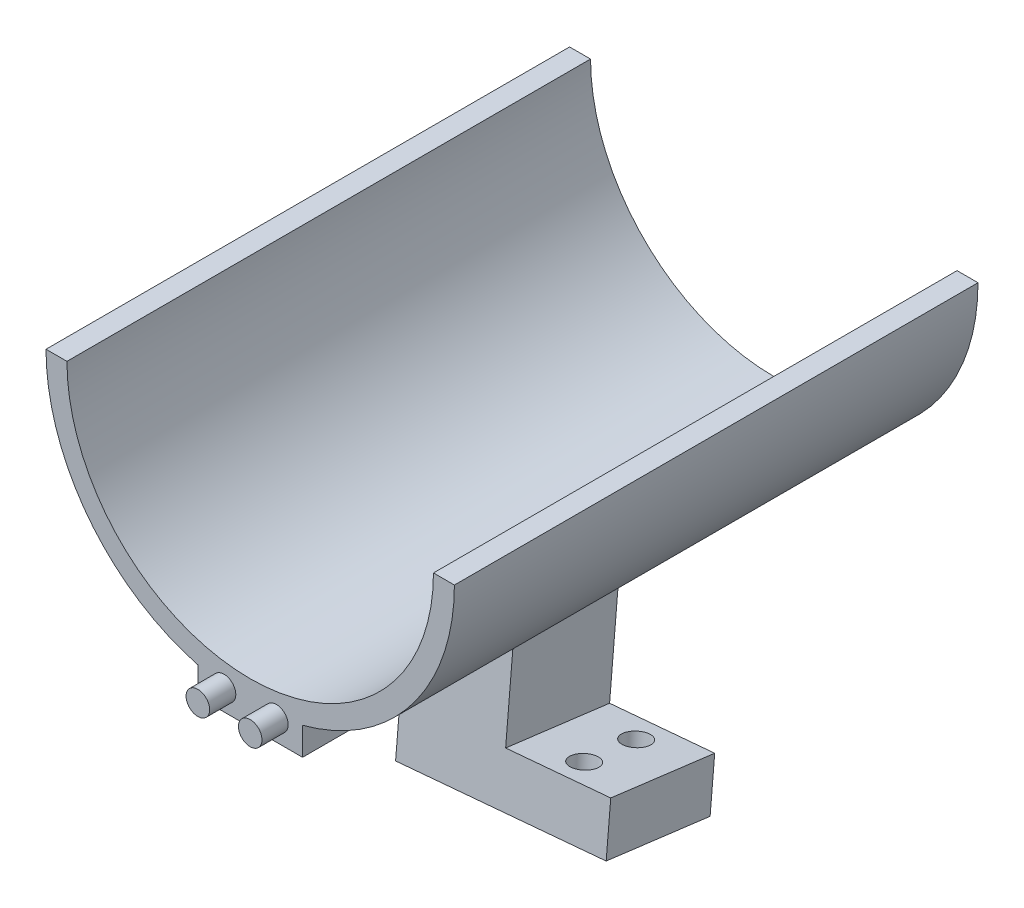
ISO-10303-21;
HEADER;
FILE_DESCRIPTION(('STEP AP214'),'2;1');
FILE_NAME('part.step','',(''),(''),'','','');
FILE_SCHEMA(('AUTOMOTIVE_DESIGN { 1 0 10303 214 1 1 1 1 }'));
ENDSEC;
DATA;
#1=APPLICATION_CONTEXT('core data for automotive mechanical design processes');
#2=APPLICATION_PROTOCOL_DEFINITION('international standard','automotive_design',2000,#1);
#3=PRODUCT_CONTEXT('',#1,'mechanical');
#4=PRODUCT('Part','Part','',(#3));
#5=PRODUCT_RELATED_PRODUCT_CATEGORY('part','',(#4));
#6=PRODUCT_DEFINITION_FORMATION('','',#4);
#7=PRODUCT_DEFINITION_CONTEXT('part definition',#1,'design');
#8=PRODUCT_DEFINITION('design','',#6,#7);
#9=PRODUCT_DEFINITION_SHAPE('','',#8);
#10=(LENGTH_UNIT() NAMED_UNIT(*) SI_UNIT(.MILLI.,.METRE.));
#11=(NAMED_UNIT(*) PLANE_ANGLE_UNIT() SI_UNIT($,.RADIAN.));
#12=(NAMED_UNIT(*) SI_UNIT($,.STERADIAN.) SOLID_ANGLE_UNIT());
#13=UNCERTAINTY_MEASURE_WITH_UNIT(LENGTH_MEASURE(1.E-05),#10,'distance_accuracy_value','');
#14=(GEOMETRIC_REPRESENTATION_CONTEXT(3) GLOBAL_UNCERTAINTY_ASSIGNED_CONTEXT((#13)) GLOBAL_UNIT_ASSIGNED_CONTEXT((#10,
#11,#12)) REPRESENTATION_CONTEXT('',''));
#15=CARTESIAN_POINT('',(0.,0.,0.));
#16=DIRECTION('',(0.,0.,1.));
#17=DIRECTION('',(1.,0.,0.));
#18=AXIS2_PLACEMENT_3D('',#15,#16,#17);
#19=CARTESIAN_POINT('',(9.99999999999999,3.11086419730137,35.544910429642));
#20=DIRECTION('',(-1.,0.,0.));
#21=DIRECTION('',(0.,0.,1.));
#22=AXIS2_PLACEMENT_3D('',#19,#20,#21);
#23=PLANE('',#22);
#24=DIRECTION('',(0.,0.126169711722161,0.992008671254413));
#25=VECTOR('',#24,1.);
#26=CARTESIAN_POINT('',(9.99999999999999,-63.3733207576804,41.3615229169633));
#27=LINE('',#26,#25);
#28=CARTESIAN_POINT('',(9.99999999999999,-63.3733207576805,41.3615229169633));
#29=VERTEX_POINT('',#28);
#30=CARTESIAN_POINT('',(10.,-60.8479825019435,61.2169811988849));
#31=VERTEX_POINT('',#30);
#32=EDGE_CURVE('E54',#29,#31,#27,.T.);
#33=ORIENTED_EDGE('',*,*,#32,.F.);
#34=DIRECTION('',(0.,-0.996194698091746,0.0871557427476515));
#35=VECTOR('',#34,1.);
#36=CARTESIAN_POINT('',(9.99999999999999,3.11086419730137,35.544910429642));
#37=LINE('',#36,#35);
#38=CARTESIAN_POINT('',(9.99999999999999,-37.6961536499415,39.1150618835755));
#39=VERTEX_POINT('',#38);
#40=EDGE_CURVE('E208',#39,#29,#37,.T.);
#41=ORIENTED_EDGE('',*,*,#40,.F.);
#42=DIRECTION('',(0.,0.,-1.));
#43=VECTOR('',#42,1.);
#44=CARTESIAN_POINT('',(10.,-37.6961536499415,100.));
#45=LINE('',#44,#43);
#46=CARTESIAN_POINT('',(10.,-37.6961536499415,59.1914586344425));
#47=VERTEX_POINT('',#46);
#48=EDGE_CURVE('E210',#47,#39,#45,.T.);
#49=ORIENTED_EDGE('',*,*,#48,.F.);
#50=DIRECTION('',(0.,-0.996194698091746,0.0871557427476515));
#51=VECTOR('',#50,1.);
#52=CARTESIAN_POINT('',(10.,4.8539790522544,55.4688043914769));
#53=LINE('',#52,#51);
#54=EDGE_CURVE('E59',#47,#31,#53,.T.);
#55=ORIENTED_EDGE('',*,*,#54,.T.);
#56=EDGE_LOOP('',(#33,#41,#49,#55));
#57=FACE_BOUND('',#56,.T.);
#58=ADVANCED_FACE('F39',(#57),#23,.F.);
#59=CARTESIAN_POINT('',(0.,0.,100.));
#60=DIRECTION('',(0.,0.,-1.));
#61=DIRECTION('',(-1.,0.,0.));
#62=AXIS2_PLACEMENT_3D('',#59,#60,#61);
#63=CYLINDRICAL_SURFACE('',#62,39.);
#64=DIRECTION('',(0.,0.,-1.));
#65=VECTOR('',#64,1.);
#66=CARTESIAN_POINT('',(10.,-37.6961536499415,100.));
#67=LINE('',#66,#65);
#68=CARTESIAN_POINT('',(10.,-37.6961536499415,0.));
#69=VERTEX_POINT('',#68);
#70=CARTESIAN_POINT('',(10.,-37.6961536499415,9.99999999999999));
#71=VERTEX_POINT('',#70);
#72=EDGE_CURVE('E256',#69,#71,#67,.F.);
#73=ORIENTED_EDGE('',*,*,#72,.F.);
#74=CARTESIAN_POINT('',(0.,0.,0.));
#75=DIRECTION('',(0.,0.,1.));
#76=DIRECTION('',(1.,0.,0.));
#77=AXIS2_PLACEMENT_3D('',#74,#75,#76);
#78=CIRCLE('',#77,39.);
#79=CARTESIAN_POINT('',(39.,0.,0.));
#80=VERTEX_POINT('',#79);
#81=EDGE_CURVE('E301',#69,#80,#78,.T.);
#82=ORIENTED_EDGE('',*,*,#81,.T.);
#83=DIRECTION('',(0.,0.,-1.));
#84=VECTOR('',#83,1.);
#85=CARTESIAN_POINT('',(39.,0.,100.));
#86=LINE('',#85,#84);
#87=CARTESIAN_POINT('',(39.,0.,100.));
#88=VERTEX_POINT('',#87);
#89=EDGE_CURVE('E11',#88,#80,#86,.T.);
#90=ORIENTED_EDGE('',*,*,#89,.F.);
#91=CARTESIAN_POINT('',(0.,0.,100.));
#92=DIRECTION('',(0.,0.,1.));
#93=DIRECTION('',(1.,0.,0.));
#94=AXIS2_PLACEMENT_3D('',#91,#92,#93);
#95=CIRCLE('',#94,39.);
#96=CARTESIAN_POINT('',(10.,-37.6961536499415,100.));
#97=VERTEX_POINT('',#96);
#98=EDGE_CURVE('E306',#97,#88,#95,.T.);
#99=ORIENTED_EDGE('',*,*,#98,.F.);
#100=DIRECTION('',(0.,0.,-1.));
#101=VECTOR('',#100,1.);
#102=CARTESIAN_POINT('',(10.,-37.6961536499415,100.));
#103=LINE('',#102,#101);
#104=CARTESIAN_POINT('',(10.,-37.6961536499415,90.));
#105=VERTEX_POINT('',#104);
#106=EDGE_CURVE('E293',#97,#105,#103,.T.);
#107=ORIENTED_EDGE('',*,*,#106,.T.);
#108=CARTESIAN_POINT('',(0.,0.,90.));
#109=DIRECTION('',(0.,0.,1.));
#110=DIRECTION('',(1.,0.,0.));
#111=AXIS2_PLACEMENT_3D('',#108,#109,#110);
#112=CIRCLE('',#111,39.);
#113=CARTESIAN_POINT('',(-10.,-37.6961536499415,90.));
#114=VERTEX_POINT('',#113);
#115=EDGE_CURVE('E299',#114,#105,#112,.T.);
#116=ORIENTED_EDGE('',*,*,#115,.F.);
#117=DIRECTION('',(0.,0.,-1.));
#118=VECTOR('',#117,1.);
#119=CARTESIAN_POINT('',(-10.,-37.6961536499415,100.));
#120=LINE('',#119,#118);
#121=CARTESIAN_POINT('',(-10.,-37.6961536499415,100.));
#122=VERTEX_POINT('',#121);
#123=EDGE_CURVE('E297',#122,#114,#120,.T.);
#124=ORIENTED_EDGE('',*,*,#123,.F.);
#125=CARTESIAN_POINT('',(-39.,0.,100.));
#126=VERTEX_POINT('',#125);
#127=EDGE_CURVE('E302',#126,#122,#95,.T.);
#128=ORIENTED_EDGE('',*,*,#127,.F.);
#129=DIRECTION('',(0.,0.,-1.));
#130=VECTOR('',#129,1.);
#131=CARTESIAN_POINT('',(-39.,0.,100.));
#132=LINE('',#131,#130);
#133=CARTESIAN_POINT('',(-39.,0.,0.));
#134=VERTEX_POINT('',#133);
#135=EDGE_CURVE('E314',#126,#134,#132,.T.);
#136=ORIENTED_EDGE('',*,*,#135,.T.);
#137=CARTESIAN_POINT('',(-10.,-37.6961536499415,0.));
#138=VERTEX_POINT('',#137);
#139=EDGE_CURVE('E315',#134,#138,#78,.T.);
#140=ORIENTED_EDGE('',*,*,#139,.T.);
#141=DIRECTION('',(0.,0.,-1.));
#142=VECTOR('',#141,1.);
#143=CARTESIAN_POINT('',(-10.,-37.6961536499415,100.));
#144=LINE('',#143,#142);
#145=CARTESIAN_POINT('',(-10.,-37.6961536499415,9.99999999999999));
#146=VERTEX_POINT('',#145);
#147=EDGE_CURVE('E253',#138,#146,#144,.F.);
#148=ORIENTED_EDGE('',*,*,#147,.T.);
#149=CARTESIAN_POINT('',(0.,0.,9.99999999999999));
#150=DIRECTION('',(0.,0.,-1.));
#151=DIRECTION('',(-1.,0.,0.));
#152=AXIS2_PLACEMENT_3D('',#149,#150,#151);
#153=CIRCLE('',#152,39.);
#154=EDGE_CURVE('E259',#71,#146,#153,.T.);
#155=ORIENTED_EDGE('',*,*,#154,.F.);
#156=EDGE_LOOP('',(#73,#82,#90,#99,#107,#116,#124,#128,#136,#140,#148,#155));
#157=FACE_BOUND('',#156,.T.);
#158=ORIENTED_EDGE('',*,*,#48,.T.);
#159=CARTESIAN_POINT('',(0.,0.,35.8170757806745));
#160=DIRECTION('',(0.,0.0871557427476515,0.996194698091746));
#161=DIRECTION('',(0.,0.996194698091746,-0.0871557427476515));
#162=AXIS2_PLACEMENT_3D('',#159,#160,#161);
#163=ELLIPSE('',#162,39.1489736641905,39.);
#164=CARTESIAN_POINT('',(-9.99999999999999,-37.6961536499415,39.1150618835756));
#165=VERTEX_POINT('',#164);
#166=EDGE_CURVE('E207',#39,#165,#163,.F.);
#167=ORIENTED_EDGE('',*,*,#166,.T.);
#168=DIRECTION('',(0.,0.,-1.));
#169=VECTOR('',#168,1.);
#170=CARTESIAN_POINT('',(-9.99999999999999,-37.6961536499415,100.));
#171=LINE('',#170,#169);
#172=CARTESIAN_POINT('',(-10.,-37.6961536499415,59.1914586344425));
#173=VERTEX_POINT('',#172);
#174=EDGE_CURVE('E205',#165,#173,#171,.F.);
#175=ORIENTED_EDGE('',*,*,#174,.T.);
#176=CARTESIAN_POINT('',(0.,0.,55.8934725315415));
#177=DIRECTION('',(0.,-0.0871557427476515,-0.996194698091746));
#178=DIRECTION('',(0.,0.996194698091746,-0.0871557427476515));
#179=AXIS2_PLACEMENT_3D('',#176,#177,#178);
#180=ELLIPSE('',#179,39.1489736641905,39.);
#181=EDGE_CURVE('E212',#173,#47,#180,.F.);
#182=ORIENTED_EDGE('',*,*,#181,.T.);
#183=EDGE_LOOP('',(#158,#167,#175,#182));
#184=FACE_BOUND('',#183,.T.);
#185=ADVANCED_FACE('F41',(#157,#184),#63,.T.);
#186=CARTESIAN_POINT('',(35.,0.,100.));
#187=DIRECTION('',(0.,1.,0.));
#188=DIRECTION('',(0.,0.,1.));
#189=AXIS2_PLACEMENT_3D('',#186,#187,#188);
#190=PLANE('',#189);
#191=DIRECTION('',(1.,0.,0.));
#192=VECTOR('',#191,1.);
#193=CARTESIAN_POINT('',(35.,0.,0.));
#194=LINE('',#193,#192);
#195=CARTESIAN_POINT('',(35.,0.,0.));
#196=VERTEX_POINT('',#195);
#197=EDGE_CURVE('E317',#196,#80,#194,.T.);
#198=ORIENTED_EDGE('',*,*,#197,.F.);
#199=DIRECTION('',(0.,0.,-1.));
#200=VECTOR('',#199,1.);
#201=CARTESIAN_POINT('',(35.,0.,100.));
#202=LINE('',#201,#200);
#203=CARTESIAN_POINT('',(35.,0.,100.));
#204=VERTEX_POINT('',#203);
#205=EDGE_CURVE('E47',#204,#196,#202,.T.);
#206=ORIENTED_EDGE('',*,*,#205,.F.);
#207=DIRECTION('',(1.,0.,0.));
#208=VECTOR('',#207,1.);
#209=CARTESIAN_POINT('',(35.,0.,100.));
#210=LINE('',#209,#208);
#211=EDGE_CURVE('E305',#204,#88,#210,.T.);
#212=ORIENTED_EDGE('',*,*,#211,.T.);
#213=ORIENTED_EDGE('',*,*,#89,.T.);
#214=EDGE_LOOP('',(#198,#206,#212,#213));
#215=FACE_BOUND('',#214,.T.);
#216=ADVANCED_FACE('F336',(#215),#190,.T.);
#217=CARTESIAN_POINT('',(0.,0.,100.));
#218=DIRECTION('',(0.,0.,-1.));
#219=DIRECTION('',(-1.,0.,0.));
#220=AXIS2_PLACEMENT_3D('',#217,#218,#219);
#221=CYLINDRICAL_SURFACE('',#220,35.);
#222=ORIENTED_EDGE('',*,*,#205,.T.);
#223=CARTESIAN_POINT('',(0.,0.,0.));
#224=DIRECTION('',(0.,0.,1.));
#225=DIRECTION('',(1.,0.,0.));
#226=AXIS2_PLACEMENT_3D('',#223,#224,#225);
#227=CIRCLE('',#226,35.);
#228=CARTESIAN_POINT('',(-35.,0.,0.));
#229=VERTEX_POINT('',#228);
#230=EDGE_CURVE('E320',#229,#196,#227,.T.);
#231=ORIENTED_EDGE('',*,*,#230,.F.);
#232=DIRECTION('',(0.,0.,-1.));
#233=VECTOR('',#232,1.);
#234=CARTESIAN_POINT('',(-35.,0.,100.));
#235=LINE('',#234,#233);
#236=CARTESIAN_POINT('',(-35.,0.,100.));
#237=VERTEX_POINT('',#236);
#238=EDGE_CURVE('E326',#237,#229,#235,.T.);
#239=ORIENTED_EDGE('',*,*,#238,.F.);
#240=CARTESIAN_POINT('',(0.,0.,100.));
#241=DIRECTION('',(0.,0.,1.));
#242=DIRECTION('',(1.,0.,0.));
#243=AXIS2_PLACEMENT_3D('',#240,#241,#242);
#244=CIRCLE('',#243,35.);
#245=EDGE_CURVE('E309',#237,#204,#244,.T.);
#246=ORIENTED_EDGE('',*,*,#245,.T.);
#247=EDGE_LOOP('',(#222,#231,#239,#246));
#248=FACE_BOUND('',#247,.T.);
#249=ADVANCED_FACE('F332',(#248),#221,.F.);
#250=CARTESIAN_POINT('',(-39.,0.,100.));
#251=DIRECTION('',(0.,1.,0.));
#252=DIRECTION('',(-1.,0.,0.));
#253=AXIS2_PLACEMENT_3D('',#250,#251,#252);
#254=PLANE('',#253);
#255=DIRECTION('',(1.,0.,0.));
#256=VECTOR('',#255,1.);
#257=CARTESIAN_POINT('',(-39.,0.,0.));
#258=LINE('',#257,#256);
#259=EDGE_CURVE('E322',#134,#229,#258,.T.);
#260=ORIENTED_EDGE('',*,*,#259,.F.);
#261=ORIENTED_EDGE('',*,*,#135,.F.);
#262=DIRECTION('',(1.,0.,0.));
#263=VECTOR('',#262,1.);
#264=CARTESIAN_POINT('',(-39.,0.,100.));
#265=LINE('',#264,#263);
#266=EDGE_CURVE('E311',#126,#237,#265,.T.);
#267=ORIENTED_EDGE('',*,*,#266,.T.);
#268=ORIENTED_EDGE('',*,*,#238,.T.);
#269=EDGE_LOOP('',(#260,#261,#267,#268));
#270=FACE_BOUND('',#269,.T.);
#271=ADVANCED_FACE('F345',(#270),#254,.T.);
#272=CARTESIAN_POINT('',(0.,0.,100.));
#273=DIRECTION('',(0.,0.,1.));
#274=DIRECTION('',(1.,0.,0.));
#275=AXIS2_PLACEMENT_3D('',#272,#273,#274);
#276=PLANE('',#275);
#277=CARTESIAN_POINT('',(5.,-39.,100.));
#278=DIRECTION('',(0.,0.,1.));
#279=DIRECTION('',(1.,0.,0.));
#280=AXIS2_PLACEMENT_3D('',#277,#278,#279);
#281=CIRCLE('',#280,2.25);
#282=CARTESIAN_POINT('',(7.25,-39.,100.));
#283=VERTEX_POINT('',#282);
#284=EDGE_CURVE('E262',#283,#283,#281,.T.);
#285=ORIENTED_EDGE('',*,*,#284,.F.);
#286=EDGE_LOOP('',(#285));
#287=FACE_BOUND('',#286,.T.);
#288=CARTESIAN_POINT('',(-5.,-39.,100.));
#289=DIRECTION('',(0.,0.,1.));
#290=DIRECTION('',(1.,0.,0.));
#291=AXIS2_PLACEMENT_3D('',#288,#289,#290);
#292=CIRCLE('',#291,2.25);
#293=CARTESIAN_POINT('',(-2.75,-39.,100.));
#294=VERTEX_POINT('',#293);
#295=EDGE_CURVE('E266',#294,#294,#292,.T.);
#296=ORIENTED_EDGE('',*,*,#295,.F.);
#297=EDGE_LOOP('',(#296));
#298=FACE_BOUND('',#297,.T.);
#299=ORIENTED_EDGE('',*,*,#127,.T.);
#300=DIRECTION('',(0.,1.,0.));
#301=VECTOR('',#300,1.);
#302=CARTESIAN_POINT('',(-10.,0.,100.));
#303=LINE('',#302,#301);
#304=CARTESIAN_POINT('',(-10.,-43.,100.));
#305=VERTEX_POINT('',#304);
#306=EDGE_CURVE('E279',#305,#122,#303,.T.);
#307=ORIENTED_EDGE('',*,*,#306,.F.);
#308=DIRECTION('',(1.,0.,0.));
#309=VECTOR('',#308,1.);
#310=CARTESIAN_POINT('',(0.,-43.,100.));
#311=LINE('',#310,#309);
#312=CARTESIAN_POINT('',(10.,-43.,100.));
#313=VERTEX_POINT('',#312);
#314=EDGE_CURVE('E272',#305,#313,#311,.T.);
#315=ORIENTED_EDGE('',*,*,#314,.T.);
#316=DIRECTION('',(0.,1.,0.));
#317=VECTOR('',#316,1.);
#318=CARTESIAN_POINT('',(10.,0.,100.));
#319=LINE('',#318,#317);
#320=EDGE_CURVE('E288',#313,#97,#319,.T.);
#321=ORIENTED_EDGE('',*,*,#320,.T.);
#322=ORIENTED_EDGE('',*,*,#98,.T.);
#323=ORIENTED_EDGE('',*,*,#211,.F.);
#324=ORIENTED_EDGE('',*,*,#245,.F.);
#325=ORIENTED_EDGE('',*,*,#266,.F.);
#326=EDGE_LOOP('',(#299,#307,#315,#321,#322,#323,#324,#325));
#327=FACE_BOUND('',#326,.T.);
#328=ADVANCED_FACE('F349',(#287,#298,#327),#276,.T.);
#329=CARTESIAN_POINT('',(0.,0.,0.));
#330=DIRECTION('',(0.,0.,1.));
#331=DIRECTION('',(1.,0.,0.));
#332=AXIS2_PLACEMENT_3D('',#329,#330,#331);
#333=PLANE('',#332);
#334=CARTESIAN_POINT('',(5.,-39.,0.));
#335=DIRECTION('',(0.,0.,-1.));
#336=DIRECTION('',(-1.,0.,0.));
#337=AXIS2_PLACEMENT_3D('',#334,#335,#336);
#338=CIRCLE('',#337,2.25);
#339=CARTESIAN_POINT('',(2.75,-39.,0.));
#340=VERTEX_POINT('',#339);
#341=EDGE_CURVE('E225',#340,#340,#338,.T.);
#342=ORIENTED_EDGE('',*,*,#341,.F.);
#343=EDGE_LOOP('',(#342));
#344=FACE_BOUND('',#343,.T.);
#345=CARTESIAN_POINT('',(-5.,-39.,0.));
#346=DIRECTION('',(0.,0.,-1.));
#347=DIRECTION('',(-1.,0.,0.));
#348=AXIS2_PLACEMENT_3D('',#345,#346,#347);
#349=CIRCLE('',#348,2.25);
#350=CARTESIAN_POINT('',(-7.25,-39.,0.));
#351=VERTEX_POINT('',#350);
#352=EDGE_CURVE('E220',#351,#351,#349,.T.);
#353=ORIENTED_EDGE('',*,*,#352,.F.);
#354=EDGE_LOOP('',(#353));
#355=FACE_BOUND('',#354,.T.);
#356=ORIENTED_EDGE('',*,*,#81,.F.);
#357=DIRECTION('',(0.,1.,0.));
#358=VECTOR('',#357,1.);
#359=CARTESIAN_POINT('',(10.,0.,0.));
#360=LINE('',#359,#358);
#361=CARTESIAN_POINT('',(10.,-43.,0.));
#362=VERTEX_POINT('',#361);
#363=EDGE_CURVE('E237',#362,#69,#360,.T.);
#364=ORIENTED_EDGE('',*,*,#363,.F.);
#365=DIRECTION('',(-1.,0.,0.));
#366=VECTOR('',#365,1.);
#367=CARTESIAN_POINT('',(0.,-43.,0.));
#368=LINE('',#367,#366);
#369=CARTESIAN_POINT('',(-10.,-43.,0.));
#370=VERTEX_POINT('',#369);
#371=EDGE_CURVE('E224',#362,#370,#368,.T.);
#372=ORIENTED_EDGE('',*,*,#371,.T.);
#373=DIRECTION('',(0.,1.,0.));
#374=VECTOR('',#373,1.);
#375=CARTESIAN_POINT('',(-10.,0.,0.));
#376=LINE('',#375,#374);
#377=EDGE_CURVE('E246',#370,#138,#376,.T.);
#378=ORIENTED_EDGE('',*,*,#377,.T.);
#379=ORIENTED_EDGE('',*,*,#139,.F.);
#380=ORIENTED_EDGE('',*,*,#259,.T.);
#381=ORIENTED_EDGE('',*,*,#230,.T.);
#382=ORIENTED_EDGE('',*,*,#197,.T.);
#383=EDGE_LOOP('',(#356,#364,#372,#378,#379,#380,#381,#382));
#384=FACE_BOUND('',#383,.T.);
#385=ADVANCED_FACE('F339',(#344,#355,#384),#333,.F.);
#386=CARTESIAN_POINT('',(-10.,0.,90.));
#387=DIRECTION('',(1.,0.,0.));
#388=DIRECTION('',(0.,0.,-1.));
#389=AXIS2_PLACEMENT_3D('',#386,#387,#388);
#390=PLANE('',#389);
#391=ORIENTED_EDGE('',*,*,#306,.T.);
#392=ORIENTED_EDGE('',*,*,#123,.T.);
#393=DIRECTION('',(0.,1.,0.));
#394=VECTOR('',#393,1.);
#395=CARTESIAN_POINT('',(-10.,0.,90.));
#396=LINE('',#395,#394);
#397=CARTESIAN_POINT('',(-10.,-43.,90.));
#398=VERTEX_POINT('',#397);
#399=EDGE_CURVE('E282',#398,#114,#396,.T.);
#400=ORIENTED_EDGE('',*,*,#399,.F.);
#401=DIRECTION('',(0.,0.,1.));
#402=VECTOR('',#401,1.);
#403=CARTESIAN_POINT('',(-10.,-43.,90.));
#404=LINE('',#403,#402);
#405=EDGE_CURVE('E291',#398,#305,#404,.T.);
#406=ORIENTED_EDGE('',*,*,#405,.T.);
#407=EDGE_LOOP('',(#391,#392,#400,#406));
#408=FACE_BOUND('',#407,.T.);
#409=ADVANCED_FACE('F406',(#408),#390,.F.);
#410=CARTESIAN_POINT('',(10.,0.,90.));
#411=DIRECTION('',(1.,0.,0.));
#412=DIRECTION('',(0.,0.,-1.));
#413=AXIS2_PLACEMENT_3D('',#410,#411,#412);
#414=PLANE('',#413);
#415=ORIENTED_EDGE('',*,*,#106,.F.);
#416=ORIENTED_EDGE('',*,*,#320,.F.);
#417=DIRECTION('',(0.,0.,1.));
#418=VECTOR('',#417,1.);
#419=CARTESIAN_POINT('',(10.,-43.,90.));
#420=LINE('',#419,#418);
#421=CARTESIAN_POINT('',(10.,-43.,90.));
#422=VERTEX_POINT('',#421);
#423=EDGE_CURVE('E285',#422,#313,#420,.T.);
#424=ORIENTED_EDGE('',*,*,#423,.F.);
#425=DIRECTION('',(0.,1.,0.));
#426=VECTOR('',#425,1.);
#427=CARTESIAN_POINT('',(10.,0.,90.));
#428=LINE('',#427,#426);
#429=EDGE_CURVE('E278',#422,#105,#428,.T.);
#430=ORIENTED_EDGE('',*,*,#429,.T.);
#431=EDGE_LOOP('',(#415,#416,#424,#430));
#432=FACE_BOUND('',#431,.T.);
#433=ADVANCED_FACE('F413',(#432),#414,.T.);
#434=CARTESIAN_POINT('',(0.,-43.,90.));
#435=DIRECTION('',(0.,-1.,0.));
#436=DIRECTION('',(0.,0.,-1.));
#437=AXIS2_PLACEMENT_3D('',#434,#435,#436);
#438=PLANE('',#437);
#439=ORIENTED_EDGE('',*,*,#314,.F.);
#440=ORIENTED_EDGE('',*,*,#405,.F.);
#441=DIRECTION('',(1.,0.,0.));
#442=VECTOR('',#441,1.);
#443=CARTESIAN_POINT('',(0.,-43.,90.));
#444=LINE('',#443,#442);
#445=EDGE_CURVE('E275',#398,#422,#444,.T.);
#446=ORIENTED_EDGE('',*,*,#445,.T.);
#447=ORIENTED_EDGE('',*,*,#423,.T.);
#448=EDGE_LOOP('',(#439,#440,#446,#447));
#449=FACE_BOUND('',#448,.T.);
#450=ADVANCED_FACE('F723',(#449),#438,.T.);
#451=CARTESIAN_POINT('',(0.,0.,90.));
#452=DIRECTION('',(0.,0.,1.));
#453=DIRECTION('',(1.,0.,0.));
#454=AXIS2_PLACEMENT_3D('',#451,#452,#453);
#455=PLANE('',#454);
#456=ORIENTED_EDGE('',*,*,#399,.T.);
#457=ORIENTED_EDGE('',*,*,#115,.T.);
#458=ORIENTED_EDGE('',*,*,#429,.F.);
#459=ORIENTED_EDGE('',*,*,#445,.F.);
#460=EDGE_LOOP('',(#456,#457,#458,#459));
#461=FACE_BOUND('',#460,.T.);
#462=ADVANCED_FACE('F452',(#461),#455,.F.);
#463=CARTESIAN_POINT('',(-5.,-39.,105.));
#464=DIRECTION('',(0.,0.,-1.));
#465=DIRECTION('',(-1.,0.,0.));
#466=AXIS2_PLACEMENT_3D('',#463,#464,#465);
#467=CYLINDRICAL_SURFACE('',#466,2.25);
#468=CARTESIAN_POINT('',(-5.,-39.,105.));
#469=DIRECTION('',(0.,0.,1.));
#470=DIRECTION('',(1.,0.,0.));
#471=AXIS2_PLACEMENT_3D('',#468,#469,#470);
#472=CIRCLE('',#471,2.25);
#473=CARTESIAN_POINT('',(-2.75,-39.,105.));
#474=VERTEX_POINT('',#473);
#475=EDGE_CURVE('E269',#474,#474,#472,.T.);
#476=ORIENTED_EDGE('',*,*,#475,.F.);
#477=EDGE_LOOP('',(#476));
#478=FACE_BOUND('',#477,.T.);
#479=ORIENTED_EDGE('',*,*,#295,.T.);
#480=EDGE_LOOP('',(#479));
#481=FACE_BOUND('',#480,.T.);
#482=ADVANCED_FACE('F457',(#478,#481),#467,.T.);
#483=CARTESIAN_POINT('',(0.,0.,105.));
#484=DIRECTION('',(0.,0.,1.));
#485=DIRECTION('',(1.,0.,0.));
#486=AXIS2_PLACEMENT_3D('',#483,#484,#485);
#487=PLANE('',#486);
#488=ORIENTED_EDGE('',*,*,#475,.T.);
#489=EDGE_LOOP('',(#488));
#490=FACE_BOUND('',#489,.T.);
#491=ADVANCED_FACE('F462',(#490),#487,.T.);
#492=CARTESIAN_POINT('',(5.,-39.,105.));
#493=DIRECTION('',(0.,0.,-1.));
#494=DIRECTION('',(-1.,0.,0.));
#495=AXIS2_PLACEMENT_3D('',#492,#493,#494);
#496=CYLINDRICAL_SURFACE('',#495,2.25);
#497=CARTESIAN_POINT('',(5.,-39.,105.));
#498=DIRECTION('',(0.,0.,1.));
#499=DIRECTION('',(1.,0.,0.));
#500=AXIS2_PLACEMENT_3D('',#497,#498,#499);
#501=CIRCLE('',#500,2.25);
#502=CARTESIAN_POINT('',(7.25,-39.,105.));
#503=VERTEX_POINT('',#502);
#504=EDGE_CURVE('E263',#503,#503,#501,.T.);
#505=ORIENTED_EDGE('',*,*,#504,.F.);
#506=EDGE_LOOP('',(#505));
#507=FACE_BOUND('',#506,.T.);
#508=ORIENTED_EDGE('',*,*,#284,.T.);
#509=EDGE_LOOP('',(#508));
#510=FACE_BOUND('',#509,.T.);
#511=ADVANCED_FACE('F473',(#507,#510),#496,.T.);
#512=CARTESIAN_POINT('',(0.,0.,105.));
#513=DIRECTION('',(0.,0.,1.));
#514=DIRECTION('',(1.,0.,0.));
#515=AXIS2_PLACEMENT_3D('',#512,#513,#514);
#516=PLANE('',#515);
#517=ORIENTED_EDGE('',*,*,#504,.T.);
#518=EDGE_LOOP('',(#517));
#519=FACE_BOUND('',#518,.T.);
#520=ADVANCED_FACE('F483',(#519),#516,.T.);
#521=CARTESIAN_POINT('',(10.,0.,10.));
#522=DIRECTION('',(-1.,0.,0.));
#523=DIRECTION('',(0.,0.,1.));
#524=AXIS2_PLACEMENT_3D('',#521,#522,#523);
#525=PLANE('',#524);
#526=ORIENTED_EDGE('',*,*,#363,.T.);
#527=ORIENTED_EDGE('',*,*,#72,.T.);
#528=DIRECTION('',(0.,1.,0.));
#529=VECTOR('',#528,1.);
#530=CARTESIAN_POINT('',(10.,0.,10.));
#531=LINE('',#530,#529);
#532=CARTESIAN_POINT('',(10.,-43.,10.));
#533=VERTEX_POINT('',#532);
#534=EDGE_CURVE('E240',#533,#71,#531,.T.);
#535=ORIENTED_EDGE('',*,*,#534,.F.);
#536=DIRECTION('',(0.,0.,-1.));
#537=VECTOR('',#536,1.);
#538=CARTESIAN_POINT('',(10.,-43.,10.));
#539=LINE('',#538,#537);
#540=EDGE_CURVE('E251',#533,#362,#539,.T.);
#541=ORIENTED_EDGE('',*,*,#540,.T.);
#542=EDGE_LOOP('',(#526,#527,#535,#541));
#543=FACE_BOUND('',#542,.T.);
#544=ADVANCED_FACE('F357',(#543),#525,.F.);
#545=CARTESIAN_POINT('',(-10.,0.,10.));
#546=DIRECTION('',(-1.,0.,0.));
#547=DIRECTION('',(0.,0.,1.));
#548=AXIS2_PLACEMENT_3D('',#545,#546,#547);
#549=PLANE('',#548);
#550=ORIENTED_EDGE('',*,*,#147,.F.);
#551=ORIENTED_EDGE('',*,*,#377,.F.);
#552=DIRECTION('',(0.,0.,-1.));
#553=VECTOR('',#552,1.);
#554=CARTESIAN_POINT('',(-10.,-43.,10.));
#555=LINE('',#554,#553);
#556=CARTESIAN_POINT('',(-10.,-43.,10.));
#557=VERTEX_POINT('',#556);
#558=EDGE_CURVE('E243',#557,#370,#555,.T.);
#559=ORIENTED_EDGE('',*,*,#558,.F.);
#560=DIRECTION('',(0.,1.,0.));
#561=VECTOR('',#560,1.);
#562=CARTESIAN_POINT('',(-10.,0.,10.));
#563=LINE('',#562,#561);
#564=EDGE_CURVE('E236',#557,#146,#563,.T.);
#565=ORIENTED_EDGE('',*,*,#564,.T.);
#566=EDGE_LOOP('',(#550,#551,#559,#565));
#567=FACE_BOUND('',#566,.T.);
#568=ADVANCED_FACE('F366',(#567),#549,.T.);
#569=CARTESIAN_POINT('',(0.,-43.,10.));
#570=DIRECTION('',(0.,-1.,0.));
#571=DIRECTION('',(0.,0.,-1.));
#572=AXIS2_PLACEMENT_3D('',#569,#570,#571);
#573=PLANE('',#572);
#574=ORIENTED_EDGE('',*,*,#371,.F.);
#575=ORIENTED_EDGE('',*,*,#540,.F.);
#576=DIRECTION('',(-1.,0.,0.));
#577=VECTOR('',#576,1.);
#578=CARTESIAN_POINT('',(0.,-43.,10.));
#579=LINE('',#578,#577);
#580=EDGE_CURVE('E233',#533,#557,#579,.T.);
#581=ORIENTED_EDGE('',*,*,#580,.T.);
#582=ORIENTED_EDGE('',*,*,#558,.T.);
#583=EDGE_LOOP('',(#574,#575,#581,#582));
#584=FACE_BOUND('',#583,.T.);
#585=ADVANCED_FACE('F360',(#584),#573,.T.);
#586=CARTESIAN_POINT('',(0.,0.,10.));
#587=DIRECTION('',(0.,0.,-1.));
#588=DIRECTION('',(-1.,0.,0.));
#589=AXIS2_PLACEMENT_3D('',#586,#587,#588);
#590=PLANE('',#589);
#591=ORIENTED_EDGE('',*,*,#534,.T.);
#592=ORIENTED_EDGE('',*,*,#154,.T.);
#593=ORIENTED_EDGE('',*,*,#564,.F.);
#594=ORIENTED_EDGE('',*,*,#580,.F.);
#595=EDGE_LOOP('',(#591,#592,#593,#594));
#596=FACE_BOUND('',#595,.T.);
#597=ADVANCED_FACE('F368',(#596),#590,.F.);
#598=CARTESIAN_POINT('',(-5.,-39.,6.));
#599=DIRECTION('',(0.,0.,-1.));
#600=DIRECTION('',(-1.,0.,0.));
#601=AXIS2_PLACEMENT_3D('',#598,#599,#600);
#602=CYLINDRICAL_SURFACE('',#601,2.25);
#603=CARTESIAN_POINT('',(-5.,-39.,6.));
#604=DIRECTION('',(0.,0.,-1.));
#605=DIRECTION('',(-1.,0.,0.));
#606=AXIS2_PLACEMENT_3D('',#603,#604,#605);
#607=CIRCLE('',#606,2.25);
#608=CARTESIAN_POINT('',(-7.25,-39.,6.));
#609=VERTEX_POINT('',#608);
#610=EDGE_CURVE('E228',#609,#609,#607,.T.);
#611=ORIENTED_EDGE('',*,*,#610,.F.);
#612=EDGE_LOOP('',(#611));
#613=FACE_BOUND('',#612,.T.);
#614=ORIENTED_EDGE('',*,*,#352,.T.);
#615=EDGE_LOOP('',(#614));
#616=FACE_BOUND('',#615,.T.);
#617=ADVANCED_FACE('F370',(#613,#616),#602,.F.);
#618=CARTESIAN_POINT('',(0.,0.,6.));
#619=DIRECTION('',(0.,0.,-1.));
#620=DIRECTION('',(-1.,0.,0.));
#621=AXIS2_PLACEMENT_3D('',#618,#619,#620);
#622=PLANE('',#621);
#623=ORIENTED_EDGE('',*,*,#610,.T.);
#624=EDGE_LOOP('',(#623));
#625=FACE_BOUND('',#624,.T.);
#626=ADVANCED_FACE('F376',(#625),#622,.T.);
#627=CARTESIAN_POINT('',(5.,-39.,6.));
#628=DIRECTION('',(0.,0.,-1.));
#629=DIRECTION('',(-1.,0.,0.));
#630=AXIS2_PLACEMENT_3D('',#627,#628,#629);
#631=CYLINDRICAL_SURFACE('',#630,2.25);
#632=CARTESIAN_POINT('',(5.,-39.,6.));
#633=DIRECTION('',(0.,0.,-1.));
#634=DIRECTION('',(-1.,0.,0.));
#635=AXIS2_PLACEMENT_3D('',#632,#633,#634);
#636=CIRCLE('',#635,2.25);
#637=CARTESIAN_POINT('',(2.75,-39.,6.));
#638=VERTEX_POINT('',#637);
#639=EDGE_CURVE('E221',#638,#638,#636,.T.);
#640=ORIENTED_EDGE('',*,*,#639,.F.);
#641=EDGE_LOOP('',(#640));
#642=FACE_BOUND('',#641,.T.);
#643=ORIENTED_EDGE('',*,*,#341,.T.);
#644=EDGE_LOOP('',(#643));
#645=FACE_BOUND('',#644,.T.);
#646=ADVANCED_FACE('F392',(#642,#645),#631,.F.);
#647=CARTESIAN_POINT('',(0.,0.,6.));
#648=DIRECTION('',(0.,0.,-1.));
#649=DIRECTION('',(-1.,0.,0.));
#650=AXIS2_PLACEMENT_3D('',#647,#648,#649);
#651=PLANE('',#650);
#652=ORIENTED_EDGE('',*,*,#639,.T.);
#653=EDGE_LOOP('',(#652));
#654=FACE_BOUND('',#653,.T.);
#655=ADVANCED_FACE('F389',(#654),#651,.T.);
#656=CARTESIAN_POINT('',(-10.,3.11086419730137,35.544910429642));
#657=DIRECTION('',(0.,0.0871557427476515,0.996194698091746));
#658=DIRECTION('',(0.,-0.996194698091746,0.0871557427476515));
#659=AXIS2_PLACEMENT_3D('',#656,#657,#658);
#660=PLANE('',#659);
#661=ORIENTED_EDGE('',*,*,#166,.F.);
#662=ORIENTED_EDGE('',*,*,#40,.T.);
#663=DIRECTION('',(-0.99664710311391,-0.0815088903864252,0.00713110388541954));
#664=VECTOR('',#663,1.);
#665=CARTESIAN_POINT('',(29.9329420622782,-61.7431429499519,41.2189008392549));
#666=LINE('',#665,#664);
#667=CARTESIAN_POINT('',(29.9329420622782,-61.7431429499519,41.2189008392549));
#668=VERTEX_POINT('',#667);
#669=EDGE_CURVE('E175',#668,#29,#666,.T.);
#670=ORIENTED_EDGE('',*,*,#669,.F.);
#671=DIRECTION('',(0.,0.996194698091746,-0.0871557427476492));
#672=VECTOR('',#671,1.);
#673=CARTESIAN_POINT('',(29.9329420622782,-71.7431429499518,42.093787474514));
#674=LINE('',#673,#672);
#675=CARTESIAN_POINT('',(29.9329420622782,-71.7431429499518,42.093787474514));
#676=VERTEX_POINT('',#675);
#677=EDGE_CURVE('E178',#676,#668,#674,.T.);
#678=ORIENTED_EDGE('',*,*,#677,.F.);
#679=DIRECTION('',(-0.99664710311391,-0.0815088903864291,0.00713110388538917));
#680=VECTOR('',#679,1.);
#681=CARTESIAN_POINT('',(-12.2122707813266,-75.1899091355446,42.3953404415785));
#682=LINE('',#681,#680);
#683=CARTESIAN_POINT('',(-10.,-75.0089827714817,42.37951143579));
#684=VERTEX_POINT('',#683);
#685=EDGE_CURVE('E165',#676,#684,#682,.T.);
#686=ORIENTED_EDGE('',*,*,#685,.T.);
#687=DIRECTION('',(0.,-0.996194698091746,0.0871557427476515));
#688=VECTOR('',#687,1.);
#689=CARTESIAN_POINT('',(-10.,3.11086419730137,35.544910429642));
#690=LINE('',#689,#688);
#691=EDGE_CURVE('E216',#165,#684,#690,.T.);
#692=ORIENTED_EDGE('',*,*,#691,.F.);
#693=EDGE_LOOP('',(#661,#662,#670,#678,#686,#692));
#694=FACE_BOUND('',#693,.T.);
#695=ADVANCED_FACE('F180',(#694),#660,.F.);
#696=CARTESIAN_POINT('',(-10.,3.11086419730137,35.544910429642));
#697=DIRECTION('',(1.,0.,0.));
#698=DIRECTION('',(0.,0.,-1.));
#699=AXIS2_PLACEMENT_3D('',#696,#697,#698);
#700=PLANE('',#699);
#701=ORIENTED_EDGE('',*,*,#174,.F.);
#702=ORIENTED_EDGE('',*,*,#691,.T.);
#703=DIRECTION('',(0.,0.126169711722161,0.992008671254413));
#704=VECTOR('',#703,1.);
#705=CARTESIAN_POINT('',(-10.,-75.1432633987993,41.323730734841));
#706=LINE('',#705,#704);
#707=CARTESIAN_POINT('',(-10.,-72.4836445157449,62.2349697177117));
#708=VERTEX_POINT('',#707);
#709=EDGE_CURVE('E172',#684,#708,#706,.T.);
#710=ORIENTED_EDGE('',*,*,#709,.T.);
#711=DIRECTION('',(0.,-0.996194698091746,0.0871557427476515));
#712=VECTOR('',#711,1.);
#713=CARTESIAN_POINT('',(-10.,4.8539790522544,55.4688043914769));
#714=LINE('',#713,#712);
#715=EDGE_CURVE('E214',#173,#708,#714,.T.);
#716=ORIENTED_EDGE('',*,*,#715,.F.);
#717=EDGE_LOOP('',(#701,#702,#710,#716));
#718=FACE_BOUND('',#717,.T.);
#719=ADVANCED_FACE('F561',(#718),#700,.F.);
#720=CARTESIAN_POINT('',(-10.,4.8539790522544,55.4688043914769));
#721=DIRECTION('',(0.,-0.0871557427476515,-0.996194698091746));
#722=DIRECTION('',(0.,0.996194698091746,-0.0871557427476515));
#723=AXIS2_PLACEMENT_3D('',#720,#721,#722);
#724=PLANE('',#723);
#725=ORIENTED_EDGE('',*,*,#181,.F.);
#726=ORIENTED_EDGE('',*,*,#715,.T.);
#727=DIRECTION('',(0.99664710311391,0.0815088903864291,-0.00713110388538917));
#728=VECTOR('',#727,1.);
#729=CARTESIAN_POINT('',(-12.2763015538735,-72.6698075149263,62.251256869708));
#730=LINE('',#729,#728);
#731=CARTESIAN_POINT('',(29.9329420622782,-69.217804694215,61.9492457564357));
#732=VERTEX_POINT('',#731);
#733=EDGE_CURVE('E203',#708,#732,#730,.T.);
#734=ORIENTED_EDGE('',*,*,#733,.T.);
#735=DIRECTION('',(0.,-0.996194698091746,0.0871557427476519));
#736=VECTOR('',#735,1.);
#737=CARTESIAN_POINT('',(29.9329420622782,-59.217804694215,61.0743591211765));
#738=LINE('',#737,#736);
#739=CARTESIAN_POINT('',(29.9329420622782,-59.217804694215,61.0743591211765));
#740=VERTEX_POINT('',#739);
#741=EDGE_CURVE('E189',#740,#732,#738,.T.);
#742=ORIENTED_EDGE('',*,*,#741,.F.);
#743=DIRECTION('',(-0.99664710311391,-0.0815088903864252,0.00713110388541954));
#744=VECTOR('',#743,1.);
#745=CARTESIAN_POINT('',(29.9329420622782,-59.217804694215,61.0743591211765));
#746=LINE('',#745,#744);
#747=EDGE_CURVE('E197',#740,#31,#746,.T.);
#748=ORIENTED_EDGE('',*,*,#747,.T.);
#749=ORIENTED_EDGE('',*,*,#54,.F.);
#750=EDGE_LOOP('',(#725,#726,#734,#742,#748,#749));
#751=FACE_BOUND('',#750,.T.);
#752=ADVANCED_FACE('F565',(#751),#724,.F.);
#753=CARTESIAN_POINT('',(154.331064537507,-64.430608071476,18.7080936730731));
#754=DIRECTION('',(0.0817576765469085,-0.988687661731499,0.125747325480715));
#755=DIRECTION('',(0.0432208602319041,-0.122533844351347,-0.991522775446583));
#756=AXIS2_PLACEMENT_3D('',#753,#754,#755);
#757=PLANE('',#756);
#758=CARTESIAN_POINT('',(20.7837422912961,-71.8111873004289,47.5073634942773));
#759=DIRECTION('',(0.0817576765469085,-0.988687661731499,0.125747325480715));
#760=DIRECTION('',(0.,-0.126169711722161,-0.992008671254413));
#761=AXIS2_PLACEMENT_3D('',#758,#759,#760);
#762=CIRCLE('',#761,2.5);
#763=CARTESIAN_POINT('',(20.7837422912961,-72.1266115797343,45.0273418161413));
#764=VERTEX_POINT('',#763);
#765=EDGE_CURVE('E191',#764,#764,#762,.T.);
#766=ORIENTED_EDGE('',*,*,#765,.F.);
#767=EDGE_LOOP('',(#766));
#768=FACE_BOUND('',#767,.T.);
#769=CARTESIAN_POINT('',(20.7837422912961,-70.5475526616276,57.4426839596894));
#770=DIRECTION('',(0.0817576765469085,-0.988687661731499,0.125747325480715));
#771=DIRECTION('',(0.,-0.126169711722161,-0.992008671254413));
#772=AXIS2_PLACEMENT_3D('',#769,#770,#771);
#773=CIRCLE('',#772,2.5);
#774=CARTESIAN_POINT('',(20.7837422912961,-70.8629769409331,54.9626622815534));
#775=VERTEX_POINT('',#774);
#776=EDGE_CURVE('E655',#775,#775,#773,.T.);
#777=ORIENTED_EDGE('',*,*,#776,.F.);
#778=EDGE_LOOP('',(#777));
#779=FACE_BOUND('',#778,.T.);
#780=ORIENTED_EDGE('',*,*,#733,.F.);
#781=ORIENTED_EDGE('',*,*,#709,.F.);
#782=ORIENTED_EDGE('',*,*,#685,.F.);
#783=DIRECTION('',(0.,-0.12616971172216,-0.992008671254413));
#784=VECTOR('',#783,1.);
#785=CARTESIAN_POINT('',(29.9329420622782,-69.217804694215,61.9492457564357));
#786=LINE('',#785,#784);
#787=EDGE_CURVE('E170',#732,#676,#786,.T.);
#788=ORIENTED_EDGE('',*,*,#787,.F.);
#789=EDGE_LOOP('',(#780,#781,#782,#788));
#790=FACE_BOUND('',#789,.T.);
#791=ADVANCED_FACE('F168',(#768,#779,#790),#757,.T.);
#792=CARTESIAN_POINT('',(29.9329420622782,-61.7431429499519,41.2189008392549));
#793=DIRECTION('',(0.0817576765469085,-0.988687661731498,0.125747325480715));
#794=DIRECTION('',(0.,-0.126169711722161,-0.992008671254413));
#795=AXIS2_PLACEMENT_3D('',#792,#793,#794);
#796=PLANE('',#795);
#797=CARTESIAN_POINT('',(19.9664196882219,-61.9273842443313,46.2502811537273));
#798=DIRECTION('',(-0.0817576765469085,0.988687661731499,-0.125747325480715));
#799=DIRECTION('',(0.,0.12616971172216,0.992008671254413));
#800=AXIS2_PLACEMENT_3D('',#797,#798,#799);
#801=CIRCLE('',#800,2.5);
#802=CARTESIAN_POINT('',(19.9664196882219,-61.6119599650259,48.7303028318633));
#803=VERTEX_POINT('',#802);
#804=EDGE_CURVE('E654',#803,#803,#801,.T.);
#805=ORIENTED_EDGE('',*,*,#804,.F.);
#806=EDGE_LOOP('',(#805));
#807=FACE_BOUND('',#806,.T.);
#808=CARTESIAN_POINT('',(19.9664196882219,-60.66374960553,56.1856016191394));
#809=DIRECTION('',(-0.0817576765469085,0.988687661731499,-0.125747325480715));
#810=DIRECTION('',(0.,0.12616971172216,0.992008671254413));
#811=AXIS2_PLACEMENT_3D('',#808,#809,#810);
#812=CIRCLE('',#811,2.5);
#813=CARTESIAN_POINT('',(19.9664196882219,-60.3483253262246,58.6656232972754));
#814=VERTEX_POINT('',#813);
#815=EDGE_CURVE('E656',#814,#814,#812,.T.);
#816=ORIENTED_EDGE('',*,*,#815,.F.);
#817=EDGE_LOOP('',(#816));
#818=FACE_BOUND('',#817,.T.);
#819=ORIENTED_EDGE('',*,*,#32,.T.);
#820=ORIENTED_EDGE('',*,*,#747,.F.);
#821=DIRECTION('',(0.,0.126169711722161,0.992008671254413));
#822=VECTOR('',#821,1.);
#823=CARTESIAN_POINT('',(29.9329420622782,-61.7431429499519,41.2189008392549));
#824=LINE('',#823,#822);
#825=EDGE_CURVE('E184',#668,#740,#824,.T.);
#826=ORIENTED_EDGE('',*,*,#825,.F.);
#827=ORIENTED_EDGE('',*,*,#669,.T.);
#828=EDGE_LOOP('',(#819,#820,#826,#827));
#829=FACE_BOUND('',#828,.T.);
#830=ADVANCED_FACE('F602',(#807,#818,#829),#796,.F.);
#831=CARTESIAN_POINT('',(29.9329420622782,1.6301778077285,-0.142622077708392));
#832=DIRECTION('',(1.,0.,0.));
#833=DIRECTION('',(0.,0.,-1.));
#834=AXIS2_PLACEMENT_3D('',#831,#832,#833);
#835=PLANE('',#834);
#836=ORIENTED_EDGE('',*,*,#787,.T.);
#837=ORIENTED_EDGE('',*,*,#677,.T.);
#838=ORIENTED_EDGE('',*,*,#825,.T.);
#839=ORIENTED_EDGE('',*,*,#741,.T.);
#840=EDGE_LOOP('',(#836,#837,#838,#839));
#841=FACE_BOUND('',#840,.T.);
#842=ADVANCED_FACE('F187',(#841),#835,.T.);
#843=CARTESIAN_POINT('',(21.6015732191601,-80.43750284016,58.7005481287537));
#844=DIRECTION('',(-0.0817576765469085,0.988687661731499,-0.125747325480715));
#845=DIRECTION('',(0.,0.12616971172216,0.992008671254413));
#846=AXIS2_PLACEMENT_3D('',#843,#844,#845);
#847=CYLINDRICAL_SURFACE('',#846,2.5);
#848=ORIENTED_EDGE('',*,*,#776,.T.);
#849=EDGE_LOOP('',(#848));
#850=FACE_BOUND('',#849,.T.);
#851=ORIENTED_EDGE('',*,*,#815,.T.);
#852=EDGE_LOOP('',(#851));
#853=FACE_BOUND('',#852,.T.);
#854=ADVANCED_FACE('F601',(#850,#853),#847,.F.);
#855=CARTESIAN_POINT('',(21.6015732191601,-81.7011374789613,48.7652276633415));
#856=DIRECTION('',(-0.0817576765469085,0.988687661731499,-0.125747325480715));
#857=DIRECTION('',(0.,0.12616971172216,0.992008671254413));
#858=AXIS2_PLACEMENT_3D('',#855,#856,#857);
#859=CYLINDRICAL_SURFACE('',#858,2.5);
#860=ORIENTED_EDGE('',*,*,#765,.T.);
#861=EDGE_LOOP('',(#860));
#862=FACE_BOUND('',#861,.T.);
#863=ORIENTED_EDGE('',*,*,#804,.T.);
#864=EDGE_LOOP('',(#863));
#865=FACE_BOUND('',#864,.T.);
#866=ADVANCED_FACE('F629',(#862,#865),#859,.F.);
#867=CLOSED_SHELL('',(#58,#185,#216,#249,#271,#328,#385,#409,#433,#450,#462,#482,#491,#511,#520,
#544,#568,#585,#597,#617,#626,#646,#655,#695,#719,#752,#791,#830,#842,#854,#866));
#868=MANIFOLD_SOLID_BREP('B2',#867);
#869=ADVANCED_BREP_SHAPE_REPRESENTATION('',(#18,#868),#14);
#870=SHAPE_DEFINITION_REPRESENTATION(#9,#869);
ENDSEC;
END-ISO-10303-21;
